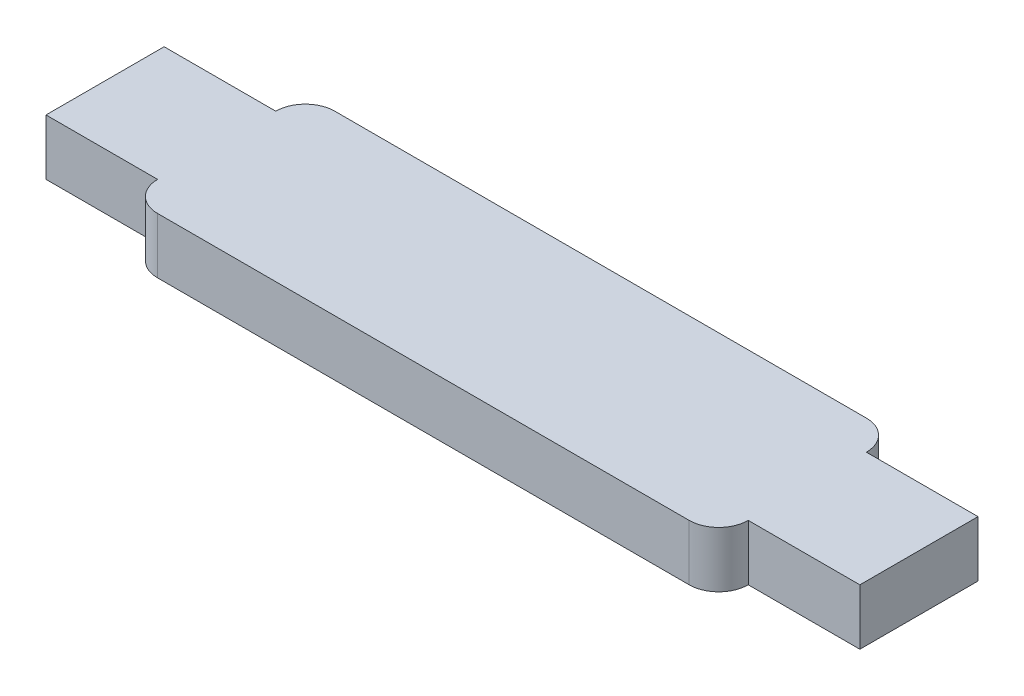
ISO-10303-21;
HEADER;
FILE_DESCRIPTION(('STEP AP214'),'2;1');
FILE_NAME('part.step','',(''),(''),'','','');
FILE_SCHEMA(('AUTOMOTIVE_DESIGN { 1 0 10303 214 1 1 1 1 }'));
ENDSEC;
DATA;
#1=APPLICATION_CONTEXT('core data for automotive mechanical design processes');
#2=APPLICATION_PROTOCOL_DEFINITION('international standard','automotive_design',2000,#1);
#3=PRODUCT_CONTEXT('',#1,'mechanical');
#4=PRODUCT('Part','Part','',(#3));
#5=PRODUCT_RELATED_PRODUCT_CATEGORY('part','',(#4));
#6=PRODUCT_DEFINITION_FORMATION('','',#4);
#7=PRODUCT_DEFINITION_CONTEXT('part definition',#1,'design');
#8=PRODUCT_DEFINITION('design','',#6,#7);
#9=PRODUCT_DEFINITION_SHAPE('','',#8);
#10=(LENGTH_UNIT() NAMED_UNIT(*) SI_UNIT(.MILLI.,.METRE.));
#11=(NAMED_UNIT(*) PLANE_ANGLE_UNIT() SI_UNIT($,.RADIAN.));
#12=(NAMED_UNIT(*) SI_UNIT($,.STERADIAN.) SOLID_ANGLE_UNIT());
#13=UNCERTAINTY_MEASURE_WITH_UNIT(LENGTH_MEASURE(1.E-05),#10,'distance_accuracy_value','');
#14=(GEOMETRIC_REPRESENTATION_CONTEXT(3) GLOBAL_UNCERTAINTY_ASSIGNED_CONTEXT((#13)) GLOBAL_UNIT_ASSIGNED_CONTEXT((#10,
#11,#12)) REPRESENTATION_CONTEXT('',''));
#15=CARTESIAN_POINT('',(0.,0.,0.));
#16=DIRECTION('',(0.,0.,1.));
#17=DIRECTION('',(1.,0.,0.));
#18=AXIS2_PLACEMENT_3D('',#15,#16,#17);
#19=CARTESIAN_POINT('',(14.2875,1.5,-3.175));
#20=DIRECTION('',(0.,-1.,0.));
#21=DIRECTION('',(0.,0.,-1.));
#22=AXIS2_PLACEMENT_3D('',#19,#20,#21);
#23=CYLINDRICAL_SURFACE('',#22,1.5875);
#24=CARTESIAN_POINT('',(14.2875,-1.5,-3.175));
#25=DIRECTION('',(0.,1.,0.));
#26=DIRECTION('',(0.,0.,1.));
#27=AXIS2_PLACEMENT_3D('',#24,#25,#26);
#28=CIRCLE('',#27,1.5875);
#29=CARTESIAN_POINT('',(15.875,-1.5,-3.175));
#30=VERTEX_POINT('',#29);
#31=CARTESIAN_POINT('',(14.2875,-1.5,-4.7625));
#32=VERTEX_POINT('',#31);
#33=EDGE_CURVE('E145',#30,#32,#28,.T.);
#34=ORIENTED_EDGE('',*,*,#33,.T.);
#35=DIRECTION('',(0.,-1.,0.));
#36=VECTOR('',#35,1.);
#37=CARTESIAN_POINT('',(14.2875,1.5,-4.7625));
#38=LINE('',#37,#36);
#39=CARTESIAN_POINT('',(14.2875,1.5,-4.7625));
#40=VERTEX_POINT('',#39);
#41=EDGE_CURVE('E11',#40,#32,#38,.T.);
#42=ORIENTED_EDGE('',*,*,#41,.F.);
#43=CARTESIAN_POINT('',(14.2875,1.5,-3.175));
#44=DIRECTION('',(0.,1.,0.));
#45=DIRECTION('',(0.,0.,1.));
#46=AXIS2_PLACEMENT_3D('',#43,#44,#45);
#47=CIRCLE('',#46,1.5875);
#48=CARTESIAN_POINT('',(15.875,1.5,-3.17499999999999));
#49=VERTEX_POINT('',#48);
#50=EDGE_CURVE('E62',#49,#40,#47,.T.);
#51=ORIENTED_EDGE('',*,*,#50,.F.);
#52=DIRECTION('',(0.,-1.,0.));
#53=VECTOR('',#52,1.);
#54=CARTESIAN_POINT('',(15.875,1.5,-3.17499999999999));
#55=LINE('',#54,#53);
#56=EDGE_CURVE('E139',#49,#30,#55,.T.);
#57=ORIENTED_EDGE('',*,*,#56,.T.);
#58=EDGE_LOOP('',(#34,#42,#51,#57));
#59=FACE_BOUND('',#58,.T.);
#60=ADVANCED_FACE('F45',(#59),#23,.T.);
#61=CARTESIAN_POINT('',(14.2875,1.5,-4.7625));
#62=DIRECTION('',(0.,0.,1.));
#63=DIRECTION('',(1.,0.,0.));
#64=AXIS2_PLACEMENT_3D('',#61,#62,#63);
#65=PLANE('',#64);
#66=DIRECTION('',(-1.,0.,0.));
#67=VECTOR('',#66,1.);
#68=CARTESIAN_POINT('',(14.2875,-1.5,-4.7625));
#69=LINE('',#68,#67);
#70=CARTESIAN_POINT('',(-14.2875,-1.5,-4.7625));
#71=VERTEX_POINT('',#70);
#72=EDGE_CURVE('E149',#32,#71,#69,.T.);
#73=ORIENTED_EDGE('',*,*,#72,.T.);
#74=DIRECTION('',(0.,-1.,0.));
#75=VECTOR('',#74,1.);
#76=CARTESIAN_POINT('',(-14.2875,1.5,-4.7625));
#77=LINE('',#76,#75);
#78=CARTESIAN_POINT('',(-14.2875,1.5,-4.7625));
#79=VERTEX_POINT('',#78);
#80=EDGE_CURVE('E54',#79,#71,#77,.T.);
#81=ORIENTED_EDGE('',*,*,#80,.F.);
#82=DIRECTION('',(-1.,0.,0.));
#83=VECTOR('',#82,1.);
#84=CARTESIAN_POINT('',(14.2875,1.5,-4.7625));
#85=LINE('',#84,#83);
#86=EDGE_CURVE('E102',#40,#79,#85,.T.);
#87=ORIENTED_EDGE('',*,*,#86,.F.);
#88=ORIENTED_EDGE('',*,*,#41,.T.);
#89=EDGE_LOOP('',(#73,#81,#87,#88));
#90=FACE_BOUND('',#89,.T.);
#91=ADVANCED_FACE('F303',(#90),#65,.F.);
#92=CARTESIAN_POINT('',(-14.2875,1.5,-3.175));
#93=DIRECTION('',(0.,-1.,0.));
#94=DIRECTION('',(0.,0.,-1.));
#95=AXIS2_PLACEMENT_3D('',#92,#93,#94);
#96=CYLINDRICAL_SURFACE('',#95,1.5875);
#97=CARTESIAN_POINT('',(-14.2875,-1.5,-3.175));
#98=DIRECTION('',(0.,1.,0.));
#99=DIRECTION('',(0.,0.,1.));
#100=AXIS2_PLACEMENT_3D('',#97,#98,#99);
#101=CIRCLE('',#100,1.5875);
#102=CARTESIAN_POINT('',(-15.875,-1.5,-3.17499999999999));
#103=VERTEX_POINT('',#102);
#104=EDGE_CURVE('E153',#71,#103,#101,.T.);
#105=ORIENTED_EDGE('',*,*,#104,.T.);
#106=DIRECTION('',(0.,-1.,0.));
#107=VECTOR('',#106,1.);
#108=CARTESIAN_POINT('',(-15.875,1.5,-3.17499999999999));
#109=LINE('',#108,#107);
#110=CARTESIAN_POINT('',(-15.875,1.5,-3.17499999999999));
#111=VERTEX_POINT('',#110);
#112=EDGE_CURVE('E171',#111,#103,#109,.T.);
#113=ORIENTED_EDGE('',*,*,#112,.F.);
#114=CARTESIAN_POINT('',(-14.2875,1.5,-3.175));
#115=DIRECTION('',(0.,1.,0.));
#116=DIRECTION('',(0.,0.,1.));
#117=AXIS2_PLACEMENT_3D('',#114,#115,#116);
#118=CIRCLE('',#117,1.5875);
#119=EDGE_CURVE('E182',#79,#111,#118,.T.);
#120=ORIENTED_EDGE('',*,*,#119,.F.);
#121=ORIENTED_EDGE('',*,*,#80,.T.);
#122=EDGE_LOOP('',(#105,#113,#120,#121));
#123=FACE_BOUND('',#122,.T.);
#124=ADVANCED_FACE('F179',(#123),#96,.T.);
#125=CARTESIAN_POINT('',(-14.2875,1.5,3.175));
#126=DIRECTION('',(0.,-1.,0.));
#127=DIRECTION('',(0.,0.,-1.));
#128=AXIS2_PLACEMENT_3D('',#125,#126,#127);
#129=CYLINDRICAL_SURFACE('',#128,1.5875);
#130=CARTESIAN_POINT('',(-14.2875,-1.5,3.175));
#131=DIRECTION('',(0.,1.,0.));
#132=DIRECTION('',(0.,0.,-1.));
#133=AXIS2_PLACEMENT_3D('',#130,#131,#132);
#134=CIRCLE('',#133,1.5875);
#135=CARTESIAN_POINT('',(-15.875,-1.5,3.175));
#136=VERTEX_POINT('',#135);
#137=CARTESIAN_POINT('',(-14.2875,-1.5,4.7625));
#138=VERTEX_POINT('',#137);
#139=EDGE_CURVE('E156',#136,#138,#134,.T.);
#140=ORIENTED_EDGE('',*,*,#139,.T.);
#141=DIRECTION('',(0.,-1.,0.));
#142=VECTOR('',#141,1.);
#143=CARTESIAN_POINT('',(-14.2875,1.5,4.7625));
#144=LINE('',#143,#142);
#145=CARTESIAN_POINT('',(-14.2875,1.5,4.7625));
#146=VERTEX_POINT('',#145);
#147=EDGE_CURVE('E132',#146,#138,#144,.T.);
#148=ORIENTED_EDGE('',*,*,#147,.F.);
#149=CARTESIAN_POINT('',(-14.2875,1.5,3.175));
#150=DIRECTION('',(0.,1.,0.));
#151=DIRECTION('',(0.,0.,-1.));
#152=AXIS2_PLACEMENT_3D('',#149,#150,#151);
#153=CIRCLE('',#152,1.5875);
#154=CARTESIAN_POINT('',(-15.875,1.5,3.17499999999999));
#155=VERTEX_POINT('',#154);
#156=EDGE_CURVE('E125',#155,#146,#153,.T.);
#157=ORIENTED_EDGE('',*,*,#156,.F.);
#158=DIRECTION('',(0.,-1.,0.));
#159=VECTOR('',#158,1.);
#160=CARTESIAN_POINT('',(-15.875,1.5,3.17499999999999));
#161=LINE('',#160,#159);
#162=EDGE_CURVE('E167',#155,#136,#161,.T.);
#163=ORIENTED_EDGE('',*,*,#162,.T.);
#164=EDGE_LOOP('',(#140,#148,#157,#163));
#165=FACE_BOUND('',#164,.T.);
#166=ADVANCED_FACE('F286',(#165),#129,.T.);
#167=CARTESIAN_POINT('',(14.2875,1.5,4.7625));
#168=DIRECTION('',(0.,0.,-1.));
#169=DIRECTION('',(-1.,0.,0.));
#170=AXIS2_PLACEMENT_3D('',#167,#168,#169);
#171=PLANE('',#170);
#172=DIRECTION('',(1.,0.,0.));
#173=VECTOR('',#172,1.);
#174=CARTESIAN_POINT('',(14.2875,-1.5,4.7625));
#175=LINE('',#174,#173);
#176=CARTESIAN_POINT('',(14.2875,-1.5,4.7625));
#177=VERTEX_POINT('',#176);
#178=EDGE_CURVE('E87',#138,#177,#175,.T.);
#179=ORIENTED_EDGE('',*,*,#178,.T.);
#180=DIRECTION('',(0.,-1.,0.));
#181=VECTOR('',#180,1.);
#182=CARTESIAN_POINT('',(14.2875,1.5,4.7625));
#183=LINE('',#182,#181);
#184=CARTESIAN_POINT('',(14.2875,1.5,4.7625));
#185=VERTEX_POINT('',#184);
#186=EDGE_CURVE('E129',#185,#177,#183,.T.);
#187=ORIENTED_EDGE('',*,*,#186,.F.);
#188=DIRECTION('',(1.,0.,0.));
#189=VECTOR('',#188,1.);
#190=CARTESIAN_POINT('',(14.2875,1.5,4.7625));
#191=LINE('',#190,#189);
#192=EDGE_CURVE('E119',#146,#185,#191,.T.);
#193=ORIENTED_EDGE('',*,*,#192,.F.);
#194=ORIENTED_EDGE('',*,*,#147,.T.);
#195=EDGE_LOOP('',(#179,#187,#193,#194));
#196=FACE_BOUND('',#195,.T.);
#197=ADVANCED_FACE('F130',(#196),#171,.F.);
#198=CARTESIAN_POINT('',(14.2875,1.5,3.175));
#199=DIRECTION('',(0.,-1.,0.));
#200=DIRECTION('',(0.,0.,-1.));
#201=AXIS2_PLACEMENT_3D('',#198,#199,#200);
#202=CYLINDRICAL_SURFACE('',#201,1.5875);
#203=CARTESIAN_POINT('',(14.2875,-1.5,3.175));
#204=DIRECTION('',(0.,1.,0.));
#205=DIRECTION('',(0.,0.,-1.));
#206=AXIS2_PLACEMENT_3D('',#203,#204,#205);
#207=CIRCLE('',#206,1.5875);
#208=CARTESIAN_POINT('',(15.875,-1.5,3.17499999999999));
#209=VERTEX_POINT('',#208);
#210=EDGE_CURVE('E94',#177,#209,#207,.T.);
#211=ORIENTED_EDGE('',*,*,#210,.T.);
#212=DIRECTION('',(0.,-1.,0.));
#213=VECTOR('',#212,1.);
#214=CARTESIAN_POINT('',(15.875,1.5,3.17499999999999));
#215=LINE('',#214,#213);
#216=CARTESIAN_POINT('',(15.875,1.5,3.17499999999999));
#217=VERTEX_POINT('',#216);
#218=EDGE_CURVE('E133',#217,#209,#215,.T.);
#219=ORIENTED_EDGE('',*,*,#218,.F.);
#220=CARTESIAN_POINT('',(14.2875,1.5,3.175));
#221=DIRECTION('',(0.,1.,0.));
#222=DIRECTION('',(0.,0.,-1.));
#223=AXIS2_PLACEMENT_3D('',#220,#221,#222);
#224=CIRCLE('',#223,1.5875);
#225=EDGE_CURVE('E123',#185,#217,#224,.T.);
#226=ORIENTED_EDGE('',*,*,#225,.F.);
#227=ORIENTED_EDGE('',*,*,#186,.T.);
#228=EDGE_LOOP('',(#211,#219,#226,#227));
#229=FACE_BOUND('',#228,.T.);
#230=ADVANCED_FACE('F135',(#229),#202,.T.);
#231=CARTESIAN_POINT('',(14.2875,1.5,-3.175));
#232=DIRECTION('',(0.,1.,0.));
#233=DIRECTION('',(0.,0.,1.));
#234=AXIS2_PLACEMENT_3D('',#231,#232,#233);
#235=PLANE('',#234);
#236=ORIENTED_EDGE('',*,*,#50,.T.);
#237=ORIENTED_EDGE('',*,*,#86,.T.);
#238=ORIENTED_EDGE('',*,*,#119,.T.);
#239=DIRECTION('',(-1.,0.,0.));
#240=VECTOR('',#239,1.);
#241=CARTESIAN_POINT('',(-21.875,1.5,-3.175));
#242=LINE('',#241,#240);
#243=CARTESIAN_POINT('',(-21.875,1.5,-3.175));
#244=VERTEX_POINT('',#243);
#245=EDGE_CURVE('E201',#111,#244,#242,.T.);
#246=ORIENTED_EDGE('',*,*,#245,.T.);
#247=DIRECTION('',(0.,0.,1.));
#248=VECTOR('',#247,1.);
#249=CARTESIAN_POINT('',(-21.875,1.5,3.175));
#250=LINE('',#249,#248);
#251=CARTESIAN_POINT('',(-21.875,1.5,3.175));
#252=VERTEX_POINT('',#251);
#253=EDGE_CURVE('E207',#244,#252,#250,.T.);
#254=ORIENTED_EDGE('',*,*,#253,.T.);
#255=DIRECTION('',(1.,0.,0.));
#256=VECTOR('',#255,1.);
#257=CARTESIAN_POINT('',(-21.875,1.5,3.175));
#258=LINE('',#257,#256);
#259=EDGE_CURVE('E212',#252,#155,#258,.T.);
#260=ORIENTED_EDGE('',*,*,#259,.T.);
#261=ORIENTED_EDGE('',*,*,#156,.T.);
#262=ORIENTED_EDGE('',*,*,#192,.T.);
#263=ORIENTED_EDGE('',*,*,#225,.T.);
#264=DIRECTION('',(-1.,0.,0.));
#265=VECTOR('',#264,1.);
#266=CARTESIAN_POINT('',(21.875,1.5,3.175));
#267=LINE('',#266,#265);
#268=CARTESIAN_POINT('',(21.875,1.5,3.175));
#269=VERTEX_POINT('',#268);
#270=EDGE_CURVE('E257',#269,#217,#267,.T.);
#271=ORIENTED_EDGE('',*,*,#270,.F.);
#272=DIRECTION('',(0.,0.,1.));
#273=VECTOR('',#272,1.);
#274=CARTESIAN_POINT('',(21.875,1.5,3.175));
#275=LINE('',#274,#273);
#276=CARTESIAN_POINT('',(21.875,1.5,-3.175));
#277=VERTEX_POINT('',#276);
#278=EDGE_CURVE('E253',#277,#269,#275,.T.);
#279=ORIENTED_EDGE('',*,*,#278,.F.);
#280=DIRECTION('',(1.,0.,0.));
#281=VECTOR('',#280,1.);
#282=CARTESIAN_POINT('',(21.875,1.5,-3.175));
#283=LINE('',#282,#281);
#284=EDGE_CURVE('E246',#49,#277,#283,.T.);
#285=ORIENTED_EDGE('',*,*,#284,.F.);
#286=EDGE_LOOP('',(#236,#237,#238,#246,#254,#260,#261,#262,#263,#271,#279,#285));
#287=FACE_BOUND('',#286,.T.);
#288=ADVANCED_FACE('F120',(#287),#235,.T.);
#289=CARTESIAN_POINT('',(14.2875,-1.5,-3.175));
#290=DIRECTION('',(0.,1.,0.));
#291=DIRECTION('',(0.,0.,1.));
#292=AXIS2_PLACEMENT_3D('',#289,#290,#291);
#293=PLANE('',#292);
#294=ORIENTED_EDGE('',*,*,#33,.F.);
#295=DIRECTION('',(-1.,0.,0.));
#296=VECTOR('',#295,1.);
#297=CARTESIAN_POINT('',(21.875,-1.5,-3.175));
#298=LINE('',#297,#296);
#299=CARTESIAN_POINT('',(21.875,-1.5,-3.175));
#300=VERTEX_POINT('',#299);
#301=EDGE_CURVE('E208',#300,#30,#298,.T.);
#302=ORIENTED_EDGE('',*,*,#301,.F.);
#303=DIRECTION('',(0.,0.,-1.));
#304=VECTOR('',#303,1.);
#305=CARTESIAN_POINT('',(21.875,-1.5,3.175));
#306=LINE('',#305,#304);
#307=CARTESIAN_POINT('',(21.875,-1.5,3.175));
#308=VERTEX_POINT('',#307);
#309=EDGE_CURVE('E215',#308,#300,#306,.T.);
#310=ORIENTED_EDGE('',*,*,#309,.F.);
#311=DIRECTION('',(1.,0.,0.));
#312=VECTOR('',#311,1.);
#313=CARTESIAN_POINT('',(21.875,-1.5,3.175));
#314=LINE('',#313,#312);
#315=EDGE_CURVE('E237',#209,#308,#314,.T.);
#316=ORIENTED_EDGE('',*,*,#315,.F.);
#317=ORIENTED_EDGE('',*,*,#210,.F.);
#318=ORIENTED_EDGE('',*,*,#178,.F.);
#319=ORIENTED_EDGE('',*,*,#139,.F.);
#320=DIRECTION('',(-1.,0.,0.));
#321=VECTOR('',#320,1.);
#322=CARTESIAN_POINT('',(-21.875,-1.5,3.175));
#323=LINE('',#322,#321);
#324=CARTESIAN_POINT('',(-21.875,-1.5,3.175));
#325=VERTEX_POINT('',#324);
#326=EDGE_CURVE('E196',#136,#325,#323,.T.);
#327=ORIENTED_EDGE('',*,*,#326,.T.);
#328=DIRECTION('',(0.,0.,-1.));
#329=VECTOR('',#328,1.);
#330=CARTESIAN_POINT('',(-21.875,-1.5,3.175));
#331=LINE('',#330,#329);
#332=CARTESIAN_POINT('',(-21.875,-1.5,-3.175));
#333=VERTEX_POINT('',#332);
#334=EDGE_CURVE('E191',#325,#333,#331,.T.);
#335=ORIENTED_EDGE('',*,*,#334,.T.);
#336=DIRECTION('',(1.,0.,0.));
#337=VECTOR('',#336,1.);
#338=CARTESIAN_POINT('',(-21.875,-1.5,-3.175));
#339=LINE('',#338,#337);
#340=EDGE_CURVE('E150',#333,#103,#339,.T.);
#341=ORIENTED_EDGE('',*,*,#340,.T.);
#342=ORIENTED_EDGE('',*,*,#104,.F.);
#343=ORIENTED_EDGE('',*,*,#72,.F.);
#344=EDGE_LOOP('',(#294,#302,#310,#316,#317,#318,#319,#327,#335,#341,#342,#343));
#345=FACE_BOUND('',#344,.T.);
#346=ADVANCED_FACE('F185',(#345),#293,.F.);
#347=CARTESIAN_POINT('',(-21.875,-10.2362749498857,3.175));
#348=DIRECTION('',(0.,0.,1.));
#349=DIRECTION('',(1.,0.,0.));
#350=AXIS2_PLACEMENT_3D('',#347,#348,#349);
#351=PLANE('',#350);
#352=ORIENTED_EDGE('',*,*,#326,.F.);
#353=ORIENTED_EDGE('',*,*,#162,.F.);
#354=ORIENTED_EDGE('',*,*,#259,.F.);
#355=DIRECTION('',(0.,1.,0.));
#356=VECTOR('',#355,1.);
#357=CARTESIAN_POINT('',(-21.875,-10.2362749498857,3.175));
#358=LINE('',#357,#356);
#359=EDGE_CURVE('E222',#325,#252,#358,.T.);
#360=ORIENTED_EDGE('',*,*,#359,.F.);
#361=EDGE_LOOP('',(#352,#353,#354,#360));
#362=FACE_BOUND('',#361,.T.);
#363=ADVANCED_FACE('F290',(#362),#351,.T.);
#364=CARTESIAN_POINT('',(-21.875,-10.2362749498857,3.175));
#365=DIRECTION('',(-1.,0.,0.));
#366=DIRECTION('',(0.,0.,1.));
#367=AXIS2_PLACEMENT_3D('',#364,#365,#366);
#368=PLANE('',#367);
#369=ORIENTED_EDGE('',*,*,#334,.F.);
#370=ORIENTED_EDGE('',*,*,#359,.T.);
#371=ORIENTED_EDGE('',*,*,#253,.F.);
#372=DIRECTION('',(0.,1.,0.));
#373=VECTOR('',#372,1.);
#374=CARTESIAN_POINT('',(-21.875,-10.2362749498857,-3.175));
#375=LINE('',#374,#373);
#376=EDGE_CURVE('E203',#333,#244,#375,.T.);
#377=ORIENTED_EDGE('',*,*,#376,.F.);
#378=EDGE_LOOP('',(#369,#370,#371,#377));
#379=FACE_BOUND('',#378,.T.);
#380=ADVANCED_FACE('F292',(#379),#368,.T.);
#381=CARTESIAN_POINT('',(-21.875,-10.2362749498857,-3.175));
#382=DIRECTION('',(0.,0.,-1.));
#383=DIRECTION('',(-1.,0.,0.));
#384=AXIS2_PLACEMENT_3D('',#381,#382,#383);
#385=PLANE('',#384);
#386=ORIENTED_EDGE('',*,*,#340,.F.);
#387=ORIENTED_EDGE('',*,*,#376,.T.);
#388=ORIENTED_EDGE('',*,*,#245,.F.);
#389=ORIENTED_EDGE('',*,*,#112,.T.);
#390=EDGE_LOOP('',(#386,#387,#388,#389));
#391=FACE_BOUND('',#390,.T.);
#392=ADVANCED_FACE('F199',(#391),#385,.T.);
#393=CARTESIAN_POINT('',(21.875,-10.2362749498857,3.175));
#394=DIRECTION('',(0.,0.,-1.));
#395=DIRECTION('',(-1.,0.,0.));
#396=AXIS2_PLACEMENT_3D('',#393,#394,#395);
#397=PLANE('',#396);
#398=ORIENTED_EDGE('',*,*,#218,.T.);
#399=ORIENTED_EDGE('',*,*,#315,.T.);
#400=DIRECTION('',(0.,1.,0.));
#401=VECTOR('',#400,1.);
#402=CARTESIAN_POINT('',(21.875,-10.2362749498857,3.175));
#403=LINE('',#402,#401);
#404=EDGE_CURVE('E242',#308,#269,#403,.T.);
#405=ORIENTED_EDGE('',*,*,#404,.T.);
#406=ORIENTED_EDGE('',*,*,#270,.T.);
#407=EDGE_LOOP('',(#398,#399,#405,#406));
#408=FACE_BOUND('',#407,.T.);
#409=ADVANCED_FACE('F299',(#408),#397,.F.);
#410=CARTESIAN_POINT('',(21.875,-10.2362749498857,3.175));
#411=DIRECTION('',(-1.,0.,0.));
#412=DIRECTION('',(0.,0.,1.));
#413=AXIS2_PLACEMENT_3D('',#410,#411,#412);
#414=PLANE('',#413);
#415=ORIENTED_EDGE('',*,*,#404,.F.);
#416=ORIENTED_EDGE('',*,*,#309,.T.);
#417=DIRECTION('',(0.,1.,0.));
#418=VECTOR('',#417,1.);
#419=CARTESIAN_POINT('',(21.875,-10.2362749498857,-3.175));
#420=LINE('',#419,#418);
#421=EDGE_CURVE('E241',#300,#277,#420,.T.);
#422=ORIENTED_EDGE('',*,*,#421,.T.);
#423=ORIENTED_EDGE('',*,*,#278,.T.);
#424=EDGE_LOOP('',(#415,#416,#422,#423));
#425=FACE_BOUND('',#424,.T.);
#426=ADVANCED_FACE('F266',(#425),#414,.F.);
#427=CARTESIAN_POINT('',(21.875,-10.2362749498857,-3.175));
#428=DIRECTION('',(0.,0.,1.));
#429=DIRECTION('',(1.,0.,0.));
#430=AXIS2_PLACEMENT_3D('',#427,#428,#429);
#431=PLANE('',#430);
#432=ORIENTED_EDGE('',*,*,#421,.F.);
#433=ORIENTED_EDGE('',*,*,#301,.T.);
#434=ORIENTED_EDGE('',*,*,#56,.F.);
#435=ORIENTED_EDGE('',*,*,#284,.T.);
#436=EDGE_LOOP('',(#432,#433,#434,#435));
#437=FACE_BOUND('',#436,.T.);
#438=ADVANCED_FACE('F310',(#437),#431,.F.);
#439=CLOSED_SHELL('',(#60,#91,#124,#166,#197,#230,#288,#346,#363,#380,#392,#409,#426,#438));
#440=MANIFOLD_SOLID_BREP('B2',#439);
#441=ADVANCED_BREP_SHAPE_REPRESENTATION('',(#18,#440),#14);
#442=SHAPE_DEFINITION_REPRESENTATION(#9,#441);
ENDSEC;
END-ISO-10303-21;
